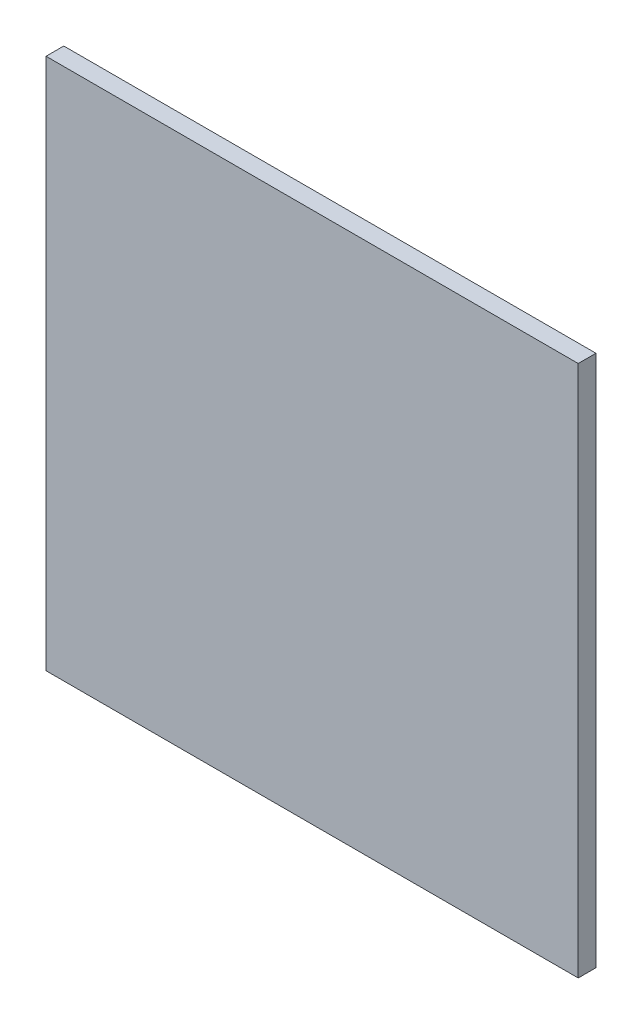
ISO-10303-21;
HEADER;
FILE_DESCRIPTION(('STEP AP214'),'2;1');
FILE_NAME('part.step','',(''),(''),'','','');
FILE_SCHEMA(('AUTOMOTIVE_DESIGN { 1 0 10303 214 1 1 1 1 }'));
ENDSEC;
DATA;
#1=APPLICATION_CONTEXT('core data for automotive mechanical design processes');
#2=APPLICATION_PROTOCOL_DEFINITION('international standard','automotive_design',2000,#1);
#3=PRODUCT_CONTEXT('',#1,'mechanical');
#4=PRODUCT('Part','Part','',(#3));
#5=PRODUCT_RELATED_PRODUCT_CATEGORY('part','',(#4));
#6=PRODUCT_DEFINITION_FORMATION('','',#4);
#7=PRODUCT_DEFINITION_CONTEXT('part definition',#1,'design');
#8=PRODUCT_DEFINITION('design','',#6,#7);
#9=PRODUCT_DEFINITION_SHAPE('','',#8);
#10=(LENGTH_UNIT() NAMED_UNIT(*) SI_UNIT(.MILLI.,.METRE.));
#11=(NAMED_UNIT(*) PLANE_ANGLE_UNIT() SI_UNIT($,.RADIAN.));
#12=(NAMED_UNIT(*) SI_UNIT($,.STERADIAN.) SOLID_ANGLE_UNIT());
#13=UNCERTAINTY_MEASURE_WITH_UNIT(LENGTH_MEASURE(1.E-05),#10,'distance_accuracy_value','');
#14=(GEOMETRIC_REPRESENTATION_CONTEXT(3) GLOBAL_UNCERTAINTY_ASSIGNED_CONTEXT((#13)) GLOBAL_UNIT_ASSIGNED_CONTEXT((#10,
#11,#12)) REPRESENTATION_CONTEXT('',''));
#15=CARTESIAN_POINT('',(0.,0.,0.));
#16=DIRECTION('',(0.,0.,1.));
#17=DIRECTION('',(1.,0.,0.));
#18=AXIS2_PLACEMENT_3D('',#15,#16,#17);
#19=CARTESIAN_POINT('',(190.5,-190.5,12.7));
#20=DIRECTION('',(-1.,0.,0.));
#21=DIRECTION('',(0.,0.,1.));
#22=AXIS2_PLACEMENT_3D('',#19,#20,#21);
#23=PLANE('',#22);
#24=DIRECTION('',(0.,1.,0.));
#25=VECTOR('',#24,1.);
#26=CARTESIAN_POINT('',(190.5,-190.5,0.));
#27=LINE('',#26,#25);
#28=CARTESIAN_POINT('',(190.5,-190.5,0.));
#29=VERTEX_POINT('',#28);
#30=CARTESIAN_POINT('',(190.5,190.5,0.));
#31=VERTEX_POINT('',#30);
#32=EDGE_CURVE('E97',#29,#31,#27,.T.);
#33=ORIENTED_EDGE('',*,*,#32,.T.);
#34=DIRECTION('',(0.,0.,-1.));
#35=VECTOR('',#34,1.);
#36=CARTESIAN_POINT('',(190.5,190.5,12.7));
#37=LINE('',#36,#35);
#38=CARTESIAN_POINT('',(190.5,190.5,12.7));
#39=VERTEX_POINT('',#38);
#40=EDGE_CURVE('E11',#39,#31,#37,.T.);
#41=ORIENTED_EDGE('',*,*,#40,.F.);
#42=DIRECTION('',(0.,1.,0.));
#43=VECTOR('',#42,1.);
#44=CARTESIAN_POINT('',(190.5,-190.5,12.7));
#45=LINE('',#44,#43);
#46=CARTESIAN_POINT('',(190.5,-190.5,12.7));
#47=VERTEX_POINT('',#46);
#48=EDGE_CURVE('E85',#47,#39,#45,.T.);
#49=ORIENTED_EDGE('',*,*,#48,.F.);
#50=DIRECTION('',(0.,0.,-1.));
#51=VECTOR('',#50,1.);
#52=CARTESIAN_POINT('',(190.5,-190.5,12.7));
#53=LINE('',#52,#51);
#54=EDGE_CURVE('E93',#47,#29,#53,.T.);
#55=ORIENTED_EDGE('',*,*,#54,.T.);
#56=EDGE_LOOP('',(#33,#41,#49,#55));
#57=FACE_BOUND('',#56,.T.);
#58=ADVANCED_FACE('F34',(#57),#23,.F.);
#59=CARTESIAN_POINT('',(-190.5,190.5,12.7));
#60=DIRECTION('',(0.,-1.,0.));
#61=DIRECTION('',(0.,0.,-1.));
#62=AXIS2_PLACEMENT_3D('',#59,#60,#61);
#63=PLANE('',#62);
#64=DIRECTION('',(-1.,0.,0.));
#65=VECTOR('',#64,1.);
#66=CARTESIAN_POINT('',(-190.5,190.5,0.));
#67=LINE('',#66,#65);
#68=CARTESIAN_POINT('',(-190.5,190.5,0.));
#69=VERTEX_POINT('',#68);
#70=EDGE_CURVE('E89',#31,#69,#67,.T.);
#71=ORIENTED_EDGE('',*,*,#70,.T.);
#72=DIRECTION('',(0.,0.,-1.));
#73=VECTOR('',#72,1.);
#74=CARTESIAN_POINT('',(-190.5,190.5,12.7));
#75=LINE('',#74,#73);
#76=CARTESIAN_POINT('',(-190.5,190.5,12.7));
#77=VERTEX_POINT('',#76);
#78=EDGE_CURVE('E42',#77,#69,#75,.T.);
#79=ORIENTED_EDGE('',*,*,#78,.F.);
#80=DIRECTION('',(-1.,0.,0.));
#81=VECTOR('',#80,1.);
#82=CARTESIAN_POINT('',(-190.5,190.5,12.7));
#83=LINE('',#82,#81);
#84=EDGE_CURVE('E80',#39,#77,#83,.T.);
#85=ORIENTED_EDGE('',*,*,#84,.F.);
#86=ORIENTED_EDGE('',*,*,#40,.T.);
#87=EDGE_LOOP('',(#71,#79,#85,#86));
#88=FACE_BOUND('',#87,.T.);
#89=ADVANCED_FACE('F88',(#88),#63,.F.);
#90=CARTESIAN_POINT('',(-190.5,-190.5,12.7));
#91=DIRECTION('',(1.,0.,0.));
#92=DIRECTION('',(0.,0.,-1.));
#93=AXIS2_PLACEMENT_3D('',#90,#91,#92);
#94=PLANE('',#93);
#95=DIRECTION('',(0.,-1.,0.));
#96=VECTOR('',#95,1.);
#97=CARTESIAN_POINT('',(-190.5,-190.5,0.));
#98=LINE('',#97,#96);
#99=CARTESIAN_POINT('',(-190.5,-190.5,0.));
#100=VERTEX_POINT('',#99);
#101=EDGE_CURVE('E67',#69,#100,#98,.T.);
#102=ORIENTED_EDGE('',*,*,#101,.T.);
#103=DIRECTION('',(0.,0.,-1.));
#104=VECTOR('',#103,1.);
#105=CARTESIAN_POINT('',(-190.5,-190.5,12.7));
#106=LINE('',#105,#104);
#107=CARTESIAN_POINT('',(-190.5,-190.5,12.7));
#108=VERTEX_POINT('',#107);
#109=EDGE_CURVE('E90',#108,#100,#106,.T.);
#110=ORIENTED_EDGE('',*,*,#109,.F.);
#111=DIRECTION('',(0.,-1.,0.));
#112=VECTOR('',#111,1.);
#113=CARTESIAN_POINT('',(-190.5,-190.5,12.7));
#114=LINE('',#113,#112);
#115=EDGE_CURVE('E83',#77,#108,#114,.T.);
#116=ORIENTED_EDGE('',*,*,#115,.F.);
#117=ORIENTED_EDGE('',*,*,#78,.T.);
#118=EDGE_LOOP('',(#102,#110,#116,#117));
#119=FACE_BOUND('',#118,.T.);
#120=ADVANCED_FACE('F91',(#119),#94,.F.);
#121=CARTESIAN_POINT('',(-190.5,-190.5,12.7));
#122=DIRECTION('',(0.,1.,0.));
#123=DIRECTION('',(0.,0.,1.));
#124=AXIS2_PLACEMENT_3D('',#121,#122,#123);
#125=PLANE('',#124);
#126=DIRECTION('',(1.,0.,0.));
#127=VECTOR('',#126,1.);
#128=CARTESIAN_POINT('',(-190.5,-190.5,0.));
#129=LINE('',#128,#127);
#130=EDGE_CURVE('E73',#100,#29,#129,.T.);
#131=ORIENTED_EDGE('',*,*,#130,.T.);
#132=ORIENTED_EDGE('',*,*,#54,.F.);
#133=DIRECTION('',(1.,0.,0.));
#134=VECTOR('',#133,1.);
#135=CARTESIAN_POINT('',(-190.5,-190.5,12.7));
#136=LINE('',#135,#134);
#137=EDGE_CURVE('E50',#108,#47,#136,.T.);
#138=ORIENTED_EDGE('',*,*,#137,.F.);
#139=ORIENTED_EDGE('',*,*,#109,.T.);
#140=EDGE_LOOP('',(#131,#132,#138,#139));
#141=FACE_BOUND('',#140,.T.);
#142=ADVANCED_FACE('F104',(#141),#125,.F.);
#143=CARTESIAN_POINT('',(0.,0.,12.7));
#144=DIRECTION('',(0.,0.,-1.));
#145=DIRECTION('',(-1.,0.,0.));
#146=AXIS2_PLACEMENT_3D('',#143,#144,#145);
#147=PLANE('',#146);
#148=ORIENTED_EDGE('',*,*,#48,.T.);
#149=ORIENTED_EDGE('',*,*,#84,.T.);
#150=ORIENTED_EDGE('',*,*,#115,.T.);
#151=ORIENTED_EDGE('',*,*,#137,.T.);
#152=EDGE_LOOP('',(#148,#149,#150,#151));
#153=FACE_BOUND('',#152,.T.);
#154=ADVANCED_FACE('F81',(#153),#147,.F.);
#155=CARTESIAN_POINT('',(0.,0.,0.));
#156=DIRECTION('',(0.,0.,-1.));
#157=DIRECTION('',(-1.,0.,0.));
#158=AXIS2_PLACEMENT_3D('',#155,#156,#157);
#159=PLANE('',#158);
#160=ORIENTED_EDGE('',*,*,#32,.F.);
#161=ORIENTED_EDGE('',*,*,#130,.F.);
#162=ORIENTED_EDGE('',*,*,#101,.F.);
#163=ORIENTED_EDGE('',*,*,#70,.F.);
#164=EDGE_LOOP('',(#160,#161,#162,#163));
#165=FACE_BOUND('',#164,.T.);
#166=ADVANCED_FACE('F107',(#165),#159,.T.);
#167=CLOSED_SHELL('',(#58,#89,#120,#142,#154,#166));
#168=MANIFOLD_SOLID_BREP('B2',#167);
#169=ADVANCED_BREP_SHAPE_REPRESENTATION('',(#18,#168),#14);
#170=SHAPE_DEFINITION_REPRESENTATION(#9,#169);
ENDSEC;
END-ISO-10303-21;
